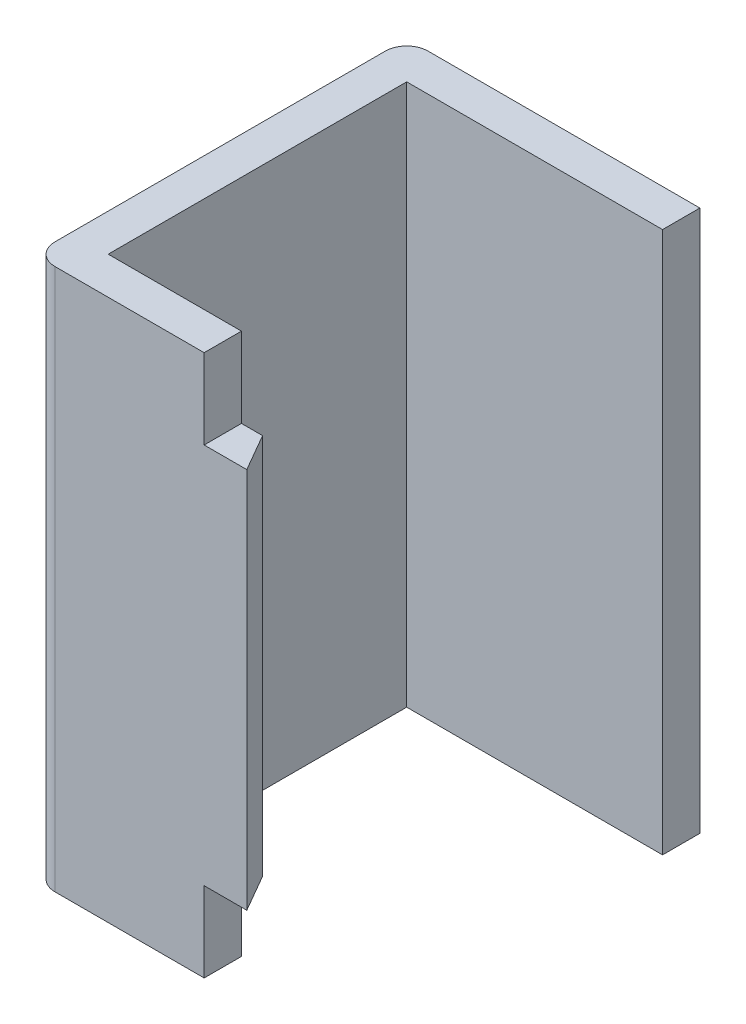
ISO-10303-21;
HEADER;
FILE_DESCRIPTION(('STEP AP214'),'2;1');
FILE_NAME('part.step','',(''),(''),'','','');
FILE_SCHEMA(('AUTOMOTIVE_DESIGN { 1 0 10303 214 1 1 1 1 }'));
ENDSEC;
DATA;
#1=APPLICATION_CONTEXT('core data for automotive mechanical design processes');
#2=APPLICATION_PROTOCOL_DEFINITION('international standard','automotive_design',2000,#1);
#3=PRODUCT_CONTEXT('',#1,'mechanical');
#4=PRODUCT('Part','Part','',(#3));
#5=PRODUCT_RELATED_PRODUCT_CATEGORY('part','',(#4));
#6=PRODUCT_DEFINITION_FORMATION('','',#4);
#7=PRODUCT_DEFINITION_CONTEXT('part definition',#1,'design');
#8=PRODUCT_DEFINITION('design','',#6,#7);
#9=PRODUCT_DEFINITION_SHAPE('','',#8);
#10=(LENGTH_UNIT() NAMED_UNIT(*) SI_UNIT(.MILLI.,.METRE.));
#11=(NAMED_UNIT(*) PLANE_ANGLE_UNIT() SI_UNIT($,.RADIAN.));
#12=(NAMED_UNIT(*) SI_UNIT($,.STERADIAN.) SOLID_ANGLE_UNIT());
#13=UNCERTAINTY_MEASURE_WITH_UNIT(LENGTH_MEASURE(1.E-05),#10,'distance_accuracy_value','');
#14=(GEOMETRIC_REPRESENTATION_CONTEXT(3) GLOBAL_UNCERTAINTY_ASSIGNED_CONTEXT((#13)) GLOBAL_UNIT_ASSIGNED_CONTEXT((#10,
#11,#12)) REPRESENTATION_CONTEXT('',''));
#15=CARTESIAN_POINT('',(0.,0.,0.));
#16=DIRECTION('',(0.,0.,1.));
#17=DIRECTION('',(1.,0.,0.));
#18=AXIS2_PLACEMENT_3D('',#15,#16,#17);
#19=CARTESIAN_POINT('',(-0.42465,0.254,0.16085));
#20=DIRECTION('',(0.,1.,0.));
#21=DIRECTION('',(0.,0.,-1.));
#22=AXIS2_PLACEMENT_3D('',#19,#20,#21);
#23=PLANE('',#22);
#24=DIRECTION('',(-1.,0.,0.));
#25=VECTOR('',#24,1.);
#26=CARTESIAN_POINT('',(-0.233,0.254,0.01));
#27=LINE('',#26,#25);
#28=CARTESIAN_POINT('',(-0.233,0.254,0.01));
#29=VERTEX_POINT('',#28);
#30=CARTESIAN_POINT('',(-0.488,0.254,0.009999999999999));
#31=VERTEX_POINT('',#30);
#32=EDGE_CURVE('E11',#29,#31,#27,.T.);
#33=ORIENTED_EDGE('',*,*,#32,.T.);
#34=CARTESIAN_POINT('',(-0.488,0.254,0.03));
#35=DIRECTION('',(0.,1.,0.));
#36=DIRECTION('',(0.,0.,1.));
#37=AXIS2_PLACEMENT_3D('',#34,#35,#36);
#38=CIRCLE('',#37,0.02);
#39=CARTESIAN_POINT('',(-0.508,0.254,0.03));
#40=VERTEX_POINT('',#39);
#41=EDGE_CURVE('E200',#31,#40,#38,.T.);
#42=ORIENTED_EDGE('',*,*,#41,.T.);
#43=DIRECTION('',(0.,0.,1.));
#44=VECTOR('',#43,1.);
#45=CARTESIAN_POINT('',(-0.508,0.254,0.02));
#46=LINE('',#45,#44);
#47=CARTESIAN_POINT('',(-0.508,0.254,0.34));
#48=VERTEX_POINT('',#47);
#49=EDGE_CURVE('E277',#40,#48,#46,.T.);
#50=ORIENTED_EDGE('',*,*,#49,.T.);
#51=CARTESIAN_POINT('',(-0.488,0.254,0.34));
#52=DIRECTION('',(0.,1.,0.));
#53=DIRECTION('',(1.,0.,0.));
#54=AXIS2_PLACEMENT_3D('',#51,#52,#53);
#55=CIRCLE('',#54,0.02);
#56=CARTESIAN_POINT('',(-0.488,0.254,0.36));
#57=VERTEX_POINT('',#56);
#58=EDGE_CURVE('E208',#48,#57,#55,.T.);
#59=ORIENTED_EDGE('',*,*,#58,.T.);
#60=DIRECTION('',(1.,0.,0.));
#61=VECTOR('',#60,1.);
#62=CARTESIAN_POINT('',(-0.498,0.254,0.36));
#63=LINE('',#62,#61);
#64=CARTESIAN_POINT('',(-0.348,0.254,0.36));
#65=VERTEX_POINT('',#64);
#66=EDGE_CURVE('E242',#57,#65,#63,.T.);
#67=ORIENTED_EDGE('',*,*,#66,.T.);
#68=DIRECTION('',(0.,0.,1.));
#69=VECTOR('',#68,1.);
#70=CARTESIAN_POINT('',(-0.348,0.254,0.325));
#71=LINE('',#70,#69);
#72=CARTESIAN_POINT('',(-0.348,0.254,0.325));
#73=VERTEX_POINT('',#72);
#74=EDGE_CURVE('E207',#73,#65,#71,.T.);
#75=ORIENTED_EDGE('',*,*,#74,.F.);
#76=DIRECTION('',(1.,0.,0.));
#77=VECTOR('',#76,1.);
#78=CARTESIAN_POINT('',(-0.498,0.254,0.325));
#79=LINE('',#78,#77);
#80=CARTESIAN_POINT('',(-0.473,0.254,0.325));
#81=VERTEX_POINT('',#80);
#82=EDGE_CURVE('E245',#81,#73,#79,.T.);
#83=ORIENTED_EDGE('',*,*,#82,.F.);
#84=DIRECTION('',(0.,0.,1.));
#85=VECTOR('',#84,1.);
#86=CARTESIAN_POINT('',(-0.473,0.254,0.02));
#87=LINE('',#86,#85);
#88=CARTESIAN_POINT('',(-0.473,0.254,0.045));
#89=VERTEX_POINT('',#88);
#90=EDGE_CURVE('E212',#89,#81,#87,.T.);
#91=ORIENTED_EDGE('',*,*,#90,.F.);
#92=DIRECTION('',(-1.,0.,0.));
#93=VECTOR('',#92,1.);
#94=CARTESIAN_POINT('',(-0.233,0.254,0.045));
#95=LINE('',#94,#93);
#96=CARTESIAN_POINT('',(-0.233,0.254,0.045));
#97=VERTEX_POINT('',#96);
#98=EDGE_CURVE('E255',#97,#89,#95,.T.);
#99=ORIENTED_EDGE('',*,*,#98,.F.);
#100=DIRECTION('',(0.,0.,-1.));
#101=VECTOR('',#100,1.);
#102=CARTESIAN_POINT('',(-0.233,0.254,0.045));
#103=LINE('',#102,#101);
#104=EDGE_CURVE('E21',#97,#29,#103,.T.);
#105=ORIENTED_EDGE('',*,*,#104,.T.);
#106=EDGE_LOOP('',(#33,#42,#50,#59,#67,#75,#83,#91,#99,#105));
#107=FACE_BOUND('',#106,.T.);
#108=ADVANCED_FACE('F17',(#107),#23,.T.);
#109=CARTESIAN_POINT('',(-0.233,0.254,0.01));
#110=DIRECTION('',(0.,0.,-1.));
#111=DIRECTION('',(0.,-1.,0.));
#112=AXIS2_PLACEMENT_3D('',#109,#110,#111);
#113=PLANE('',#112);
#114=ORIENTED_EDGE('',*,*,#32,.F.);
#115=DIRECTION('',(0.,-1.,0.));
#116=VECTOR('',#115,1.);
#117=CARTESIAN_POINT('',(-0.233,0.254,0.01));
#118=LINE('',#117,#116);
#119=CARTESIAN_POINT('',(-0.233,-0.254,0.01));
#120=VERTEX_POINT('',#119);
#121=EDGE_CURVE('E192',#29,#120,#118,.T.);
#122=ORIENTED_EDGE('',*,*,#121,.T.);
#123=DIRECTION('',(-1.,0.,0.));
#124=VECTOR('',#123,1.);
#125=CARTESIAN_POINT('',(-0.233,-0.254,0.01));
#126=LINE('',#125,#124);
#127=CARTESIAN_POINT('',(-0.488,-0.254,0.01));
#128=VERTEX_POINT('',#127);
#129=EDGE_CURVE('E218',#120,#128,#126,.T.);
#130=ORIENTED_EDGE('',*,*,#129,.T.);
#131=DIRECTION('',(0.,1.,0.));
#132=VECTOR('',#131,1.);
#133=CARTESIAN_POINT('',(-0.488,-0.254,0.01));
#134=LINE('',#133,#132);
#135=EDGE_CURVE('E28',#128,#31,#134,.T.);
#136=ORIENTED_EDGE('',*,*,#135,.T.);
#137=EDGE_LOOP('',(#114,#122,#130,#136));
#138=FACE_BOUND('',#137,.T.);
#139=ADVANCED_FACE('F391',(#138),#113,.T.);
#140=CARTESIAN_POINT('',(-0.488,-0.254,0.03));
#141=DIRECTION('',(0.,1.,0.));
#142=DIRECTION('',(0.,0.,-1.));
#143=AXIS2_PLACEMENT_3D('',#140,#141,#142);
#144=CYLINDRICAL_SURFACE('',#143,0.02);
#145=CARTESIAN_POINT('',(-0.488,-0.254,0.03));
#146=DIRECTION('',(0.,1.,0.));
#147=DIRECTION('',(0.,0.,1.));
#148=AXIS2_PLACEMENT_3D('',#145,#146,#147);
#149=CIRCLE('',#148,0.02);
#150=CARTESIAN_POINT('',(-0.508,-0.254,0.03));
#151=VERTEX_POINT('',#150);
#152=EDGE_CURVE('E198',#128,#151,#149,.T.);
#153=ORIENTED_EDGE('',*,*,#152,.T.);
#154=DIRECTION('',(0.,1.,0.));
#155=VECTOR('',#154,1.);
#156=CARTESIAN_POINT('',(-0.508,-0.254,0.03));
#157=LINE('',#156,#155);
#158=EDGE_CURVE('E280',#151,#40,#157,.T.);
#159=ORIENTED_EDGE('',*,*,#158,.T.);
#160=ORIENTED_EDGE('',*,*,#41,.F.);
#161=ORIENTED_EDGE('',*,*,#135,.F.);
#162=EDGE_LOOP('',(#153,#159,#160,#161));
#163=FACE_BOUND('',#162,.T.);
#164=ADVANCED_FACE('F318',(#163),#144,.T.);
#165=CARTESIAN_POINT('',(-0.233,0.,0.0275));
#166=DIRECTION('',(-1.,0.,0.));
#167=DIRECTION('',(0.,0.,1.));
#168=AXIS2_PLACEMENT_3D('',#165,#166,#167);
#169=PLANE('',#168);
#170=DIRECTION('',(0.,0.,1.));
#171=VECTOR('',#170,1.);
#172=CARTESIAN_POINT('',(-0.233,-0.254,0.01));
#173=LINE('',#172,#171);
#174=CARTESIAN_POINT('',(-0.233,-0.254,0.045));
#175=VERTEX_POINT('',#174);
#176=EDGE_CURVE('E222',#120,#175,#173,.T.);
#177=ORIENTED_EDGE('',*,*,#176,.F.);
#178=ORIENTED_EDGE('',*,*,#121,.F.);
#179=ORIENTED_EDGE('',*,*,#104,.F.);
#180=DIRECTION('',(0.,1.,0.));
#181=VECTOR('',#180,1.);
#182=CARTESIAN_POINT('',(-0.233,-0.254,0.045));
#183=LINE('',#182,#181);
#184=EDGE_CURVE('E251',#175,#97,#183,.T.);
#185=ORIENTED_EDGE('',*,*,#184,.F.);
#186=EDGE_LOOP('',(#177,#178,#179,#185));
#187=FACE_BOUND('',#186,.T.);
#188=ADVANCED_FACE('F404',(#187),#169,.F.);
#189=CARTESIAN_POINT('',(-0.508,0.254,0.02));
#190=DIRECTION('',(-1.,0.,0.));
#191=DIRECTION('',(0.,1.,0.));
#192=AXIS2_PLACEMENT_3D('',#189,#190,#191);
#193=PLANE('',#192);
#194=ORIENTED_EDGE('',*,*,#49,.F.);
#195=ORIENTED_EDGE('',*,*,#158,.F.);
#196=DIRECTION('',(0.,0.,1.));
#197=VECTOR('',#196,1.);
#198=CARTESIAN_POINT('',(-0.508,-0.254,0.02));
#199=LINE('',#198,#197);
#200=CARTESIAN_POINT('',(-0.508,-0.254,0.34));
#201=VERTEX_POINT('',#200);
#202=EDGE_CURVE('E194',#151,#201,#199,.T.);
#203=ORIENTED_EDGE('',*,*,#202,.T.);
#204=DIRECTION('',(0.,1.,0.));
#205=VECTOR('',#204,1.);
#206=CARTESIAN_POINT('',(-0.508,-0.254,0.34));
#207=LINE('',#206,#205);
#208=EDGE_CURVE('E211',#201,#48,#207,.T.);
#209=ORIENTED_EDGE('',*,*,#208,.T.);
#210=EDGE_LOOP('',(#194,#195,#203,#209));
#211=FACE_BOUND('',#210,.T.);
#212=ADVANCED_FACE('F327',(#211),#193,.T.);
#213=CARTESIAN_POINT('',(-0.233,-0.254,0.045));
#214=DIRECTION('',(0.,0.,1.));
#215=DIRECTION('',(1.,0.,0.));
#216=AXIS2_PLACEMENT_3D('',#213,#214,#215);
#217=PLANE('',#216);
#218=DIRECTION('',(-1.,0.,0.));
#219=VECTOR('',#218,1.);
#220=CARTESIAN_POINT('',(-0.233,-0.254,0.045));
#221=LINE('',#220,#219);
#222=CARTESIAN_POINT('',(-0.473,-0.254,0.045));
#223=VERTEX_POINT('',#222);
#224=EDGE_CURVE('E232',#175,#223,#221,.T.);
#225=ORIENTED_EDGE('',*,*,#224,.F.);
#226=ORIENTED_EDGE('',*,*,#184,.T.);
#227=ORIENTED_EDGE('',*,*,#98,.T.);
#228=DIRECTION('',(0.,1.,0.));
#229=VECTOR('',#228,1.);
#230=CARTESIAN_POINT('',(-0.473,-0.254,0.045));
#231=LINE('',#230,#229);
#232=EDGE_CURVE('E80',#223,#89,#231,.T.);
#233=ORIENTED_EDGE('',*,*,#232,.F.);
#234=EDGE_LOOP('',(#225,#226,#227,#233));
#235=FACE_BOUND('',#234,.T.);
#236=ADVANCED_FACE('F460',(#235),#217,.T.);
#237=CARTESIAN_POINT('',(-0.488,-0.254,0.34));
#238=DIRECTION('',(0.,1.,0.));
#239=DIRECTION('',(-1.,0.,0.));
#240=AXIS2_PLACEMENT_3D('',#237,#238,#239);
#241=CYLINDRICAL_SURFACE('',#240,0.02);
#242=CARTESIAN_POINT('',(-0.488,-0.254,0.34));
#243=DIRECTION('',(0.,1.,0.));
#244=DIRECTION('',(1.,0.,0.));
#245=AXIS2_PLACEMENT_3D('',#242,#243,#244);
#246=CIRCLE('',#245,0.02);
#247=CARTESIAN_POINT('',(-0.488,-0.254,0.36));
#248=VERTEX_POINT('',#247);
#249=EDGE_CURVE('E199',#201,#248,#246,.T.);
#250=ORIENTED_EDGE('',*,*,#249,.T.);
#251=DIRECTION('',(0.,1.,0.));
#252=VECTOR('',#251,1.);
#253=CARTESIAN_POINT('',(-0.488,-0.254,0.36));
#254=LINE('',#253,#252);
#255=EDGE_CURVE('E235',#248,#57,#254,.T.);
#256=ORIENTED_EDGE('',*,*,#255,.T.);
#257=ORIENTED_EDGE('',*,*,#58,.F.);
#258=ORIENTED_EDGE('',*,*,#208,.F.);
#259=EDGE_LOOP('',(#250,#256,#257,#258));
#260=FACE_BOUND('',#259,.T.);
#261=ADVANCED_FACE('F331',(#260),#241,.T.);
#262=CARTESIAN_POINT('',(-0.473,-0.254,0.02));
#263=DIRECTION('',(1.,0.,0.));
#264=DIRECTION('',(0.,1.,0.));
#265=AXIS2_PLACEMENT_3D('',#262,#263,#264);
#266=PLANE('',#265);
#267=DIRECTION('',(0.,0.,1.));
#268=VECTOR('',#267,1.);
#269=CARTESIAN_POINT('',(-0.473,-0.254,0.02));
#270=LINE('',#269,#268);
#271=CARTESIAN_POINT('',(-0.473,-0.254,0.325));
#272=VERTEX_POINT('',#271);
#273=EDGE_CURVE('E293',#223,#272,#270,.T.);
#274=ORIENTED_EDGE('',*,*,#273,.F.);
#275=ORIENTED_EDGE('',*,*,#232,.T.);
#276=ORIENTED_EDGE('',*,*,#90,.T.);
#277=DIRECTION('',(0.,1.,0.));
#278=VECTOR('',#277,1.);
#279=CARTESIAN_POINT('',(-0.473,-0.254,0.325));
#280=LINE('',#279,#278);
#281=EDGE_CURVE('E64',#272,#81,#280,.T.);
#282=ORIENTED_EDGE('',*,*,#281,.F.);
#283=EDGE_LOOP('',(#274,#275,#276,#282));
#284=FACE_BOUND('',#283,.T.);
#285=ADVANCED_FACE('F361',(#284),#266,.T.);
#286=CARTESIAN_POINT('',(-0.412237288136,0.,0.36));
#287=DIRECTION('',(0.,0.,1.));
#288=DIRECTION('',(0.,-1.,0.));
#289=AXIS2_PLACEMENT_3D('',#286,#287,#288);
#290=PLANE('',#289);
#291=ORIENTED_EDGE('',*,*,#66,.F.);
#292=ORIENTED_EDGE('',*,*,#255,.F.);
#293=DIRECTION('',(1.,0.,0.));
#294=VECTOR('',#293,1.);
#295=CARTESIAN_POINT('',(-0.498,-0.254,0.36));
#296=LINE('',#295,#294);
#297=CARTESIAN_POINT('',(-0.348,-0.254,0.36));
#298=VERTEX_POINT('',#297);
#299=EDGE_CURVE('E262',#248,#298,#296,.T.);
#300=ORIENTED_EDGE('',*,*,#299,.T.);
#301=DIRECTION('',(0.,-1.,0.));
#302=VECTOR('',#301,1.);
#303=CARTESIAN_POINT('',(-0.348,0.254,0.36));
#304=LINE('',#303,#302);
#305=CARTESIAN_POINT('',(-0.348,-0.179,0.36));
#306=VERTEX_POINT('',#305);
#307=EDGE_CURVE('E213',#306,#298,#304,.T.);
#308=ORIENTED_EDGE('',*,*,#307,.F.);
#309=DIRECTION('',(1.,0.,0.));
#310=VECTOR('',#309,1.);
#311=CARTESIAN_POINT('',(-0.348,-0.179,0.36));
#312=LINE('',#311,#310);
#313=CARTESIAN_POINT('',(-0.308,-0.179,0.36));
#314=VERTEX_POINT('',#313);
#315=EDGE_CURVE('E173',#306,#314,#312,.T.);
#316=ORIENTED_EDGE('',*,*,#315,.T.);
#317=DIRECTION('',(0.,1.,0.));
#318=VECTOR('',#317,1.);
#319=CARTESIAN_POINT('',(-0.308,-0.179,0.36));
#320=LINE('',#319,#318);
#321=CARTESIAN_POINT('',(-0.308,0.179,0.36));
#322=VERTEX_POINT('',#321);
#323=EDGE_CURVE('E170',#314,#322,#320,.T.);
#324=ORIENTED_EDGE('',*,*,#323,.T.);
#325=DIRECTION('',(1.,0.,0.));
#326=VECTOR('',#325,1.);
#327=CARTESIAN_POINT('',(-0.348,0.179,0.36));
#328=LINE('',#327,#326);
#329=CARTESIAN_POINT('',(-0.348,0.179,0.36));
#330=VERTEX_POINT('',#329);
#331=EDGE_CURVE('E156',#330,#322,#328,.T.);
#332=ORIENTED_EDGE('',*,*,#331,.F.);
#333=DIRECTION('',(0.,-1.,0.));
#334=VECTOR('',#333,1.);
#335=CARTESIAN_POINT('',(-0.348,0.254,0.36));
#336=LINE('',#335,#334);
#337=EDGE_CURVE('E226',#65,#330,#336,.T.);
#338=ORIENTED_EDGE('',*,*,#337,.F.);
#339=EDGE_LOOP('',(#291,#292,#300,#308,#316,#324,#332,#338));
#340=FACE_BOUND('',#339,.T.);
#341=ADVANCED_FACE('F19',(#340),#290,.T.);
#342=CARTESIAN_POINT('',(-0.394957652303,0.,0.325));
#343=DIRECTION('',(0.,0.,-1.));
#344=DIRECTION('',(0.,-1.,0.));
#345=AXIS2_PLACEMENT_3D('',#342,#343,#344);
#346=PLANE('',#345);
#347=DIRECTION('',(1.,0.,0.));
#348=VECTOR('',#347,1.);
#349=CARTESIAN_POINT('',(-0.498,-0.254,0.325));
#350=LINE('',#349,#348);
#351=CARTESIAN_POINT('',(-0.348,-0.254,0.325));
#352=VERTEX_POINT('',#351);
#353=EDGE_CURVE('E268',#272,#352,#350,.T.);
#354=ORIENTED_EDGE('',*,*,#353,.F.);
#355=ORIENTED_EDGE('',*,*,#281,.T.);
#356=ORIENTED_EDGE('',*,*,#82,.T.);
#357=DIRECTION('',(0.,1.,0.));
#358=VECTOR('',#357,1.);
#359=CARTESIAN_POINT('',(-0.348,-0.254,0.325));
#360=LINE('',#359,#358);
#361=CARTESIAN_POINT('',(-0.348,0.179,0.325));
#362=VERTEX_POINT('',#361);
#363=EDGE_CURVE('E203',#362,#73,#360,.T.);
#364=ORIENTED_EDGE('',*,*,#363,.F.);
#365=DIRECTION('',(1.,0.,0.));
#366=VECTOR('',#365,1.);
#367=CARTESIAN_POINT('',(-0.348,0.179,0.325));
#368=LINE('',#367,#366);
#369=CARTESIAN_POINT('',(-0.328207259422,0.179,0.325));
#370=VERTEX_POINT('',#369);
#371=EDGE_CURVE('E167',#362,#370,#368,.T.);
#372=ORIENTED_EDGE('',*,*,#371,.T.);
#373=DIRECTION('',(0.,1.,0.));
#374=VECTOR('',#373,1.);
#375=CARTESIAN_POINT('',(-0.328207259422,-0.179,0.325));
#376=LINE('',#375,#374);
#377=CARTESIAN_POINT('',(-0.328207259422,-0.179,0.325));
#378=VERTEX_POINT('',#377);
#379=EDGE_CURVE('E178',#378,#370,#376,.T.);
#380=ORIENTED_EDGE('',*,*,#379,.F.);
#381=DIRECTION('',(1.,0.,0.));
#382=VECTOR('',#381,1.);
#383=CARTESIAN_POINT('',(-0.348,-0.179,0.325));
#384=LINE('',#383,#382);
#385=CARTESIAN_POINT('',(-0.348,-0.179,0.325));
#386=VERTEX_POINT('',#385);
#387=EDGE_CURVE('E238',#386,#378,#384,.T.);
#388=ORIENTED_EDGE('',*,*,#387,.F.);
#389=DIRECTION('',(0.,1.,0.));
#390=VECTOR('',#389,1.);
#391=CARTESIAN_POINT('',(-0.348,-0.254,0.325));
#392=LINE('',#391,#390);
#393=EDGE_CURVE('E217',#352,#386,#392,.T.);
#394=ORIENTED_EDGE('',*,*,#393,.F.);
#395=EDGE_LOOP('',(#354,#355,#356,#364,#372,#380,#388,#394));
#396=FACE_BOUND('',#395,.T.);
#397=ADVANCED_FACE('F337',(#396),#346,.T.);
#398=CARTESIAN_POINT('',(-0.348,0.,0.3425));
#399=DIRECTION('',(1.,0.,0.));
#400=DIRECTION('',(0.,-1.,0.));
#401=AXIS2_PLACEMENT_3D('',#398,#399,#400);
#402=PLANE('',#401);
#403=DIRECTION('',(0.,0.,-1.));
#404=VECTOR('',#403,1.);
#405=CARTESIAN_POINT('',(-0.348,0.179,0.36));
#406=LINE('',#405,#404);
#407=EDGE_CURVE('E163',#330,#362,#406,.T.);
#408=ORIENTED_EDGE('',*,*,#407,.T.);
#409=ORIENTED_EDGE('',*,*,#363,.T.);
#410=ORIENTED_EDGE('',*,*,#74,.T.);
#411=ORIENTED_EDGE('',*,*,#337,.T.);
#412=EDGE_LOOP('',(#408,#409,#410,#411));
#413=FACE_BOUND('',#412,.T.);
#414=ADVANCED_FACE('F332',(#413),#402,.T.);
#415=CARTESIAN_POINT('',(-0.42465,-0.254,0.16085));
#416=DIRECTION('',(0.,-1.,0.));
#417=DIRECTION('',(-1.,0.,0.));
#418=AXIS2_PLACEMENT_3D('',#415,#416,#417);
#419=PLANE('',#418);
#420=ORIENTED_EDGE('',*,*,#129,.F.);
#421=ORIENTED_EDGE('',*,*,#176,.T.);
#422=ORIENTED_EDGE('',*,*,#224,.T.);
#423=ORIENTED_EDGE('',*,*,#273,.T.);
#424=ORIENTED_EDGE('',*,*,#353,.T.);
#425=DIRECTION('',(0.,0.,-1.));
#426=VECTOR('',#425,1.);
#427=CARTESIAN_POINT('',(-0.348,-0.254,0.36));
#428=LINE('',#427,#426);
#429=EDGE_CURVE('E241',#298,#352,#428,.T.);
#430=ORIENTED_EDGE('',*,*,#429,.F.);
#431=ORIENTED_EDGE('',*,*,#299,.F.);
#432=ORIENTED_EDGE('',*,*,#249,.F.);
#433=ORIENTED_EDGE('',*,*,#202,.F.);
#434=ORIENTED_EDGE('',*,*,#152,.F.);
#435=EDGE_LOOP('',(#420,#421,#422,#423,#424,#430,#431,#432,#433,#434));
#436=FACE_BOUND('',#435,.T.);
#437=ADVANCED_FACE('F324',(#436),#419,.T.);
#438=CARTESIAN_POINT('',(-0.348,0.179,0.36));
#439=DIRECTION('',(0.,1.,0.));
#440=DIRECTION('',(0.,0.,-1.));
#441=AXIS2_PLACEMENT_3D('',#438,#439,#440);
#442=PLANE('',#441);
#443=ORIENTED_EDGE('',*,*,#407,.F.);
#444=ORIENTED_EDGE('',*,*,#331,.T.);
#445=DIRECTION('',(-0.50000000000094,0.,-0.866025403783896));
#446=VECTOR('',#445,1.);
#447=CARTESIAN_POINT('',(-0.308,0.179,0.36));
#448=LINE('',#447,#446);
#449=EDGE_CURVE('E161',#322,#370,#448,.T.);
#450=ORIENTED_EDGE('',*,*,#449,.T.);
#451=ORIENTED_EDGE('',*,*,#371,.F.);
#452=EDGE_LOOP('',(#443,#444,#450,#451));
#453=FACE_BOUND('',#452,.T.);
#454=ADVANCED_FACE('F158',(#453),#442,.T.);
#455=CARTESIAN_POINT('',(-0.348,0.,0.3425));
#456=DIRECTION('',(1.,0.,0.));
#457=DIRECTION('',(0.,-1.,0.));
#458=AXIS2_PLACEMENT_3D('',#455,#456,#457);
#459=PLANE('',#458);
#460=ORIENTED_EDGE('',*,*,#429,.T.);
#461=ORIENTED_EDGE('',*,*,#393,.T.);
#462=DIRECTION('',(0.,0.,1.));
#463=VECTOR('',#462,1.);
#464=CARTESIAN_POINT('',(-0.348,-0.179,0.325));
#465=LINE('',#464,#463);
#466=EDGE_CURVE('E271',#386,#306,#465,.T.);
#467=ORIENTED_EDGE('',*,*,#466,.T.);
#468=ORIENTED_EDGE('',*,*,#307,.T.);
#469=EDGE_LOOP('',(#460,#461,#467,#468));
#470=FACE_BOUND('',#469,.T.);
#471=ADVANCED_FACE('F373',(#470),#459,.T.);
#472=CARTESIAN_POINT('',(-0.308,-0.179,0.36));
#473=DIRECTION('',(-0.866025403783896,0.,0.50000000000094));
#474=DIRECTION('',(0.,1.,0.));
#475=AXIS2_PLACEMENT_3D('',#472,#473,#474);
#476=PLANE('',#475);
#477=ORIENTED_EDGE('',*,*,#449,.F.);
#478=ORIENTED_EDGE('',*,*,#323,.F.);
#479=DIRECTION('',(-0.50000000000094,0.,-0.866025403783896));
#480=VECTOR('',#479,1.);
#481=CARTESIAN_POINT('',(-0.308,-0.179,0.36));
#482=LINE('',#481,#480);
#483=EDGE_CURVE('E188',#314,#378,#482,.T.);
#484=ORIENTED_EDGE('',*,*,#483,.T.);
#485=ORIENTED_EDGE('',*,*,#379,.T.);
#486=EDGE_LOOP('',(#477,#478,#484,#485));
#487=FACE_BOUND('',#486,.T.);
#488=ADVANCED_FACE('F181',(#487),#476,.F.);
#489=CARTESIAN_POINT('',(-0.348,-0.179,0.325));
#490=DIRECTION('',(0.,-1.,0.));
#491=DIRECTION('',(-1.,0.,0.));
#492=AXIS2_PLACEMENT_3D('',#489,#490,#491);
#493=PLANE('',#492);
#494=ORIENTED_EDGE('',*,*,#466,.F.);
#495=ORIENTED_EDGE('',*,*,#387,.T.);
#496=ORIENTED_EDGE('',*,*,#483,.F.);
#497=ORIENTED_EDGE('',*,*,#315,.F.);
#498=EDGE_LOOP('',(#494,#495,#496,#497));
#499=FACE_BOUND('',#498,.T.);
#500=ADVANCED_FACE('F372',(#499),#493,.T.);
#501=CLOSED_SHELL('',(#108,#139,#164,#188,#212,#236,#261,#285,#341,#397,#414,#437,#454,#471,
#488,#500));
#502=MANIFOLD_SOLID_BREP('B1',#501);
#503=ADVANCED_BREP_SHAPE_REPRESENTATION('',(#18,#502),#14);
#504=SHAPE_DEFINITION_REPRESENTATION(#9,#503);
ENDSEC;
END-ISO-10303-21;
